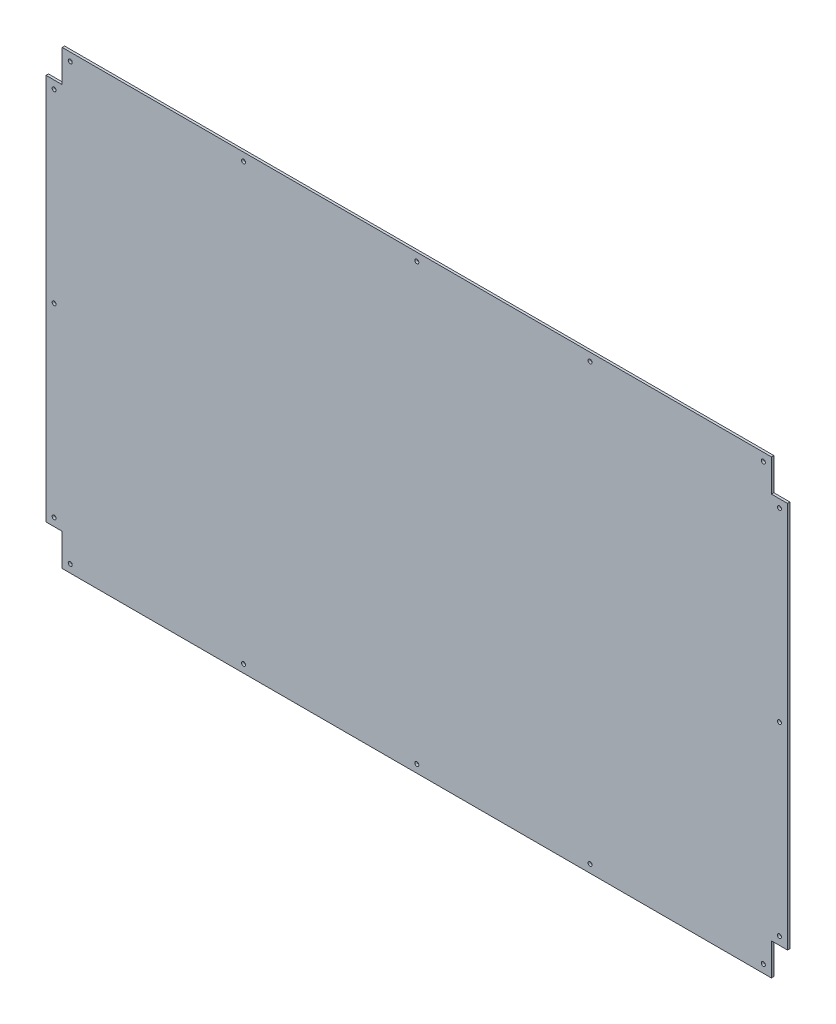
ISO-10303-21;
HEADER;
FILE_DESCRIPTION(('STEP AP214'),'2;1');
FILE_NAME('part.step','',(''),(''),'','','');
FILE_SCHEMA(('AUTOMOTIVE_DESIGN { 1 0 10303 214 1 1 1 1 }'));
ENDSEC;
DATA;
#1=APPLICATION_CONTEXT('core data for automotive mechanical design processes');
#2=APPLICATION_PROTOCOL_DEFINITION('international standard','automotive_design',2000,#1);
#3=PRODUCT_CONTEXT('',#1,'mechanical');
#4=PRODUCT('Part','Part','',(#3));
#5=PRODUCT_RELATED_PRODUCT_CATEGORY('part','',(#4));
#6=PRODUCT_DEFINITION_FORMATION('','',#4);
#7=PRODUCT_DEFINITION_CONTEXT('part definition',#1,'design');
#8=PRODUCT_DEFINITION('design','',#6,#7);
#9=PRODUCT_DEFINITION_SHAPE('','',#8);
#10=(LENGTH_UNIT() NAMED_UNIT(*) SI_UNIT(.MILLI.,.METRE.));
#11=(NAMED_UNIT(*) PLANE_ANGLE_UNIT() SI_UNIT($,.RADIAN.));
#12=(NAMED_UNIT(*) SI_UNIT($,.STERADIAN.) SOLID_ANGLE_UNIT());
#13=UNCERTAINTY_MEASURE_WITH_UNIT(LENGTH_MEASURE(1.E-05),#10,'distance_accuracy_value','');
#14=(GEOMETRIC_REPRESENTATION_CONTEXT(3) GLOBAL_UNCERTAINTY_ASSIGNED_CONTEXT((#13)) GLOBAL_UNIT_ASSIGNED_CONTEXT((#10,
#11,#12)) REPRESENTATION_CONTEXT('',''));
#15=CARTESIAN_POINT('',(0.,0.,0.));
#16=DIRECTION('',(0.,0.,1.));
#17=DIRECTION('',(1.,0.,0.));
#18=AXIS2_PLACEMENT_3D('',#15,#16,#17);
#19=CARTESIAN_POINT('',(-389.697293258029,339.185509658483,3.));
#20=DIRECTION('',(1.,0.,0.));
#21=DIRECTION('',(0.,0.,-1.));
#22=AXIS2_PLACEMENT_3D('',#19,#20,#21);
#23=PLANE('',#22);
#24=DIRECTION('',(0.,-1.,0.));
#25=VECTOR('',#24,1.);
#26=CARTESIAN_POINT('',(-389.697293258029,339.185509658483,0.));
#27=LINE('',#26,#25);
#28=CARTESIAN_POINT('',(-389.697293258029,339.185509658483,0.));
#29=VERTEX_POINT('',#28);
#30=CARTESIAN_POINT('',(-389.697293258029,299.185509658483,0.));
#31=VERTEX_POINT('',#30);
#32=EDGE_CURVE('E153',#29,#31,#27,.T.);
#33=ORIENTED_EDGE('',*,*,#32,.T.);
#34=DIRECTION('',(0.,0.,-1.));
#35=VECTOR('',#34,1.);
#36=CARTESIAN_POINT('',(-389.697293258029,299.185509658483,3.));
#37=LINE('',#36,#35);
#38=CARTESIAN_POINT('',(-389.697293258029,299.185509658483,3.));
#39=VERTEX_POINT('',#38);
#40=EDGE_CURVE('E11',#39,#31,#37,.T.);
#41=ORIENTED_EDGE('',*,*,#40,.F.);
#42=DIRECTION('',(0.,-1.,0.));
#43=VECTOR('',#42,1.);
#44=CARTESIAN_POINT('',(-389.697293258029,339.185509658483,3.));
#45=LINE('',#44,#43);
#46=CARTESIAN_POINT('',(-389.697293258029,339.185509658483,3.));
#47=VERTEX_POINT('',#46);
#48=EDGE_CURVE('E176',#47,#39,#45,.T.);
#49=ORIENTED_EDGE('',*,*,#48,.F.);
#50=DIRECTION('',(0.,0.,-1.));
#51=VECTOR('',#50,1.);
#52=CARTESIAN_POINT('',(-389.697293258029,339.185509658483,3.));
#53=LINE('',#52,#51);
#54=EDGE_CURVE('E149',#47,#29,#53,.T.);
#55=ORIENTED_EDGE('',*,*,#54,.T.);
#56=EDGE_LOOP('',(#33,#41,#49,#55));
#57=FACE_BOUND('',#56,.T.);
#58=ADVANCED_FACE('F33',(#57),#23,.F.);
#59=CARTESIAN_POINT('',(-409.697293258029,299.185509658483,3.));
#60=DIRECTION('',(0.,-1.,0.));
#61=DIRECTION('',(1.,0.,0.));
#62=AXIS2_PLACEMENT_3D('',#59,#60,#61);
#63=PLANE('',#62);
#64=DIRECTION('',(-1.,0.,0.));
#65=VECTOR('',#64,1.);
#66=CARTESIAN_POINT('',(-409.697293258029,299.185509658483,0.));
#67=LINE('',#66,#65);
#68=CARTESIAN_POINT('',(-409.697293258029,299.185509658483,0.));
#69=VERTEX_POINT('',#68);
#70=EDGE_CURVE('E156',#31,#69,#67,.T.);
#71=ORIENTED_EDGE('',*,*,#70,.T.);
#72=DIRECTION('',(0.,0.,-1.));
#73=VECTOR('',#72,1.);
#74=CARTESIAN_POINT('',(-409.697293258029,299.185509658483,3.));
#75=LINE('',#74,#73);
#76=CARTESIAN_POINT('',(-409.697293258029,299.185509658483,3.));
#77=VERTEX_POINT('',#76);
#78=EDGE_CURVE('E41',#77,#69,#75,.T.);
#79=ORIENTED_EDGE('',*,*,#78,.F.);
#80=DIRECTION('',(-1.,0.,0.));
#81=VECTOR('',#80,1.);
#82=CARTESIAN_POINT('',(-409.697293258029,299.185509658483,3.));
#83=LINE('',#82,#81);
#84=EDGE_CURVE('E104',#39,#77,#83,.T.);
#85=ORIENTED_EDGE('',*,*,#84,.F.);
#86=ORIENTED_EDGE('',*,*,#40,.T.);
#87=EDGE_LOOP('',(#71,#79,#85,#86));
#88=FACE_BOUND('',#87,.T.);
#89=ADVANCED_FACE('F256',(#88),#63,.F.);
#90=CARTESIAN_POINT('',(-409.697293258029,299.185509658483,3.));
#91=DIRECTION('',(1.,0.,0.));
#92=DIRECTION('',(0.,1.,0.));
#93=AXIS2_PLACEMENT_3D('',#90,#91,#92);
#94=PLANE('',#93);
#95=DIRECTION('',(0.,-1.,0.));
#96=VECTOR('',#95,1.);
#97=CARTESIAN_POINT('',(-409.697293258029,299.185509658483,0.));
#98=LINE('',#97,#96);
#99=CARTESIAN_POINT('',(-409.697293258029,-180.814490341518,0.));
#100=VERTEX_POINT('',#99);
#101=EDGE_CURVE('E159',#69,#100,#98,.T.);
#102=ORIENTED_EDGE('',*,*,#101,.T.);
#103=DIRECTION('',(0.,0.,-1.));
#104=VECTOR('',#103,1.);
#105=CARTESIAN_POINT('',(-409.697293258029,-180.814490341518,3.));
#106=LINE('',#105,#104);
#107=CARTESIAN_POINT('',(-409.697293258029,-180.814490341518,3.));
#108=VERTEX_POINT('',#107);
#109=EDGE_CURVE('E195',#108,#100,#106,.T.);
#110=ORIENTED_EDGE('',*,*,#109,.F.);
#111=DIRECTION('',(0.,-1.,0.));
#112=VECTOR('',#111,1.);
#113=CARTESIAN_POINT('',(-409.697293258029,299.185509658483,3.));
#114=LINE('',#113,#112);
#115=EDGE_CURVE('E203',#77,#108,#114,.T.);
#116=ORIENTED_EDGE('',*,*,#115,.F.);
#117=ORIENTED_EDGE('',*,*,#78,.T.);
#118=EDGE_LOOP('',(#102,#110,#116,#117));
#119=FACE_BOUND('',#118,.T.);
#120=ADVANCED_FACE('F201',(#119),#94,.F.);
#121=CARTESIAN_POINT('',(-409.697293258029,-180.814490341518,3.));
#122=DIRECTION('',(0.,1.,0.));
#123=DIRECTION('',(0.,0.,1.));
#124=AXIS2_PLACEMENT_3D('',#121,#122,#123);
#125=PLANE('',#124);
#126=DIRECTION('',(1.,0.,0.));
#127=VECTOR('',#126,1.);
#128=CARTESIAN_POINT('',(-409.697293258029,-180.814490341518,0.));
#129=LINE('',#128,#127);
#130=CARTESIAN_POINT('',(-389.697293258029,-180.814490341518,0.));
#131=VERTEX_POINT('',#130);
#132=EDGE_CURVE('E161',#100,#131,#129,.T.);
#133=ORIENTED_EDGE('',*,*,#132,.T.);
#134=DIRECTION('',(0.,0.,-1.));
#135=VECTOR('',#134,1.);
#136=CARTESIAN_POINT('',(-389.697293258029,-180.814490341518,3.));
#137=LINE('',#136,#135);
#138=CARTESIAN_POINT('',(-389.697293258029,-180.814490341518,3.));
#139=VERTEX_POINT('',#138);
#140=EDGE_CURVE('E192',#139,#131,#137,.T.);
#141=ORIENTED_EDGE('',*,*,#140,.F.);
#142=DIRECTION('',(1.,0.,0.));
#143=VECTOR('',#142,1.);
#144=CARTESIAN_POINT('',(-409.697293258029,-180.814490341518,3.));
#145=LINE('',#144,#143);
#146=EDGE_CURVE('E221',#108,#139,#145,.T.);
#147=ORIENTED_EDGE('',*,*,#146,.F.);
#148=ORIENTED_EDGE('',*,*,#109,.T.);
#149=EDGE_LOOP('',(#133,#141,#147,#148));
#150=FACE_BOUND('',#149,.T.);
#151=ADVANCED_FACE('F212',(#150),#125,.F.);
#152=CARTESIAN_POINT('',(-389.697293258029,-180.814490341518,3.));
#153=DIRECTION('',(1.,0.,0.));
#154=DIRECTION('',(0.,1.,0.));
#155=AXIS2_PLACEMENT_3D('',#152,#153,#154);
#156=PLANE('',#155);
#157=DIRECTION('',(0.,-1.,0.));
#158=VECTOR('',#157,1.);
#159=CARTESIAN_POINT('',(-389.697293258029,-180.814490341518,0.));
#160=LINE('',#159,#158);
#161=CARTESIAN_POINT('',(-389.697293258029,-220.814490341518,0.));
#162=VERTEX_POINT('',#161);
#163=EDGE_CURVE('E163',#131,#162,#160,.T.);
#164=ORIENTED_EDGE('',*,*,#163,.T.);
#165=DIRECTION('',(0.,0.,-1.));
#166=VECTOR('',#165,1.);
#167=CARTESIAN_POINT('',(-389.697293258029,-220.814490341518,3.));
#168=LINE('',#167,#166);
#169=CARTESIAN_POINT('',(-389.697293258029,-220.814490341518,3.));
#170=VERTEX_POINT('',#169);
#171=EDGE_CURVE('E189',#170,#162,#168,.T.);
#172=ORIENTED_EDGE('',*,*,#171,.F.);
#173=DIRECTION('',(0.,-1.,0.));
#174=VECTOR('',#173,1.);
#175=CARTESIAN_POINT('',(-389.697293258029,-180.814490341518,3.));
#176=LINE('',#175,#174);
#177=EDGE_CURVE('E218',#139,#170,#176,.T.);
#178=ORIENTED_EDGE('',*,*,#177,.F.);
#179=ORIENTED_EDGE('',*,*,#140,.T.);
#180=EDGE_LOOP('',(#164,#172,#178,#179));
#181=FACE_BOUND('',#180,.T.);
#182=ADVANCED_FACE('F216',(#181),#156,.F.);
#183=CARTESIAN_POINT('',(-389.697293258029,-220.814490341518,3.));
#184=DIRECTION('',(0.,1.,0.));
#185=DIRECTION('',(0.,0.,1.));
#186=AXIS2_PLACEMENT_3D('',#183,#184,#185);
#187=PLANE('',#186);
#188=DIRECTION('',(1.,0.,0.));
#189=VECTOR('',#188,1.);
#190=CARTESIAN_POINT('',(-389.697293258029,-220.814490341518,0.));
#191=LINE('',#190,#189);
#192=CARTESIAN_POINT('',(490.302706741972,-220.814490341518,0.));
#193=VERTEX_POINT('',#192);
#194=EDGE_CURVE('E165',#162,#193,#191,.T.);
#195=ORIENTED_EDGE('',*,*,#194,.T.);
#196=DIRECTION('',(0.,0.,-1.));
#197=VECTOR('',#196,1.);
#198=CARTESIAN_POINT('',(490.302706741972,-220.814490341518,3.));
#199=LINE('',#198,#197);
#200=CARTESIAN_POINT('',(490.302706741972,-220.814490341518,3.));
#201=VERTEX_POINT('',#200);
#202=EDGE_CURVE('E186',#201,#193,#199,.T.);
#203=ORIENTED_EDGE('',*,*,#202,.F.);
#204=DIRECTION('',(1.,0.,0.));
#205=VECTOR('',#204,1.);
#206=CARTESIAN_POINT('',(-389.697293258029,-220.814490341518,3.));
#207=LINE('',#206,#205);
#208=EDGE_CURVE('E220',#170,#201,#207,.T.);
#209=ORIENTED_EDGE('',*,*,#208,.F.);
#210=ORIENTED_EDGE('',*,*,#171,.T.);
#211=EDGE_LOOP('',(#195,#203,#209,#210));
#212=FACE_BOUND('',#211,.T.);
#213=ADVANCED_FACE('F269',(#212),#187,.F.);
#214=CARTESIAN_POINT('',(490.302706741972,-180.814490341518,3.));
#215=DIRECTION('',(-1.,0.,0.));
#216=DIRECTION('',(0.,0.,1.));
#217=AXIS2_PLACEMENT_3D('',#214,#215,#216);
#218=PLANE('',#217);
#219=DIRECTION('',(0.,1.,0.));
#220=VECTOR('',#219,1.);
#221=CARTESIAN_POINT('',(490.302706741972,-180.814490341518,0.));
#222=LINE('',#221,#220);
#223=CARTESIAN_POINT('',(490.302706741972,-180.814490341518,0.));
#224=VERTEX_POINT('',#223);
#225=EDGE_CURVE('E167',#193,#224,#222,.T.);
#226=ORIENTED_EDGE('',*,*,#225,.T.);
#227=DIRECTION('',(0.,0.,-1.));
#228=VECTOR('',#227,1.);
#229=CARTESIAN_POINT('',(490.302706741972,-180.814490341518,3.));
#230=LINE('',#229,#228);
#231=CARTESIAN_POINT('',(490.302706741972,-180.814490341518,3.));
#232=VERTEX_POINT('',#231);
#233=EDGE_CURVE('E183',#232,#224,#230,.T.);
#234=ORIENTED_EDGE('',*,*,#233,.F.);
#235=DIRECTION('',(0.,1.,0.));
#236=VECTOR('',#235,1.);
#237=CARTESIAN_POINT('',(490.302706741972,-180.814490341518,3.));
#238=LINE('',#237,#236);
#239=EDGE_CURVE('E223',#201,#232,#238,.T.);
#240=ORIENTED_EDGE('',*,*,#239,.F.);
#241=ORIENTED_EDGE('',*,*,#202,.T.);
#242=EDGE_LOOP('',(#226,#234,#240,#241));
#243=FACE_BOUND('',#242,.T.);
#244=ADVANCED_FACE('F272',(#243),#218,.F.);
#245=CARTESIAN_POINT('',(490.302706741972,-180.814490341518,3.));
#246=DIRECTION('',(0.,1.,0.));
#247=DIRECTION('',(-1.,0.,0.));
#248=AXIS2_PLACEMENT_3D('',#245,#246,#247);
#249=PLANE('',#248);
#250=DIRECTION('',(1.,0.,0.));
#251=VECTOR('',#250,1.);
#252=CARTESIAN_POINT('',(490.302706741972,-180.814490341518,0.));
#253=LINE('',#252,#251);
#254=CARTESIAN_POINT('',(510.302706741972,-180.814490341518,0.));
#255=VERTEX_POINT('',#254);
#256=EDGE_CURVE('E169',#224,#255,#253,.T.);
#257=ORIENTED_EDGE('',*,*,#256,.T.);
#258=DIRECTION('',(0.,0.,-1.));
#259=VECTOR('',#258,1.);
#260=CARTESIAN_POINT('',(510.302706741972,-180.814490341518,3.));
#261=LINE('',#260,#259);
#262=CARTESIAN_POINT('',(510.302706741972,-180.814490341518,3.));
#263=VERTEX_POINT('',#262);
#264=EDGE_CURVE('E180',#263,#255,#261,.T.);
#265=ORIENTED_EDGE('',*,*,#264,.F.);
#266=DIRECTION('',(1.,0.,0.));
#267=VECTOR('',#266,1.);
#268=CARTESIAN_POINT('',(490.302706741972,-180.814490341518,3.));
#269=LINE('',#268,#267);
#270=EDGE_CURVE('E229',#232,#263,#269,.T.);
#271=ORIENTED_EDGE('',*,*,#270,.F.);
#272=ORIENTED_EDGE('',*,*,#233,.T.);
#273=EDGE_LOOP('',(#257,#265,#271,#272));
#274=FACE_BOUND('',#273,.T.);
#275=ADVANCED_FACE('F235',(#274),#249,.F.);
#276=CARTESIAN_POINT('',(510.302706741971,299.185509658483,3.));
#277=DIRECTION('',(-1.,0.,0.));
#278=DIRECTION('',(0.,-1.,0.));
#279=AXIS2_PLACEMENT_3D('',#276,#277,#278);
#280=PLANE('',#279);
#281=DIRECTION('',(0.,1.,0.));
#282=VECTOR('',#281,1.);
#283=CARTESIAN_POINT('',(510.302706741971,299.185509658483,0.));
#284=LINE('',#283,#282);
#285=CARTESIAN_POINT('',(510.302706741971,299.185509658483,0.));
#286=VERTEX_POINT('',#285);
#287=EDGE_CURVE('E171',#255,#286,#284,.T.);
#288=ORIENTED_EDGE('',*,*,#287,.T.);
#289=DIRECTION('',(0.,0.,-1.));
#290=VECTOR('',#289,1.);
#291=CARTESIAN_POINT('',(510.302706741971,299.185509658483,3.));
#292=LINE('',#291,#290);
#293=CARTESIAN_POINT('',(510.302706741971,299.185509658483,3.));
#294=VERTEX_POINT('',#293);
#295=EDGE_CURVE('E144',#294,#286,#292,.T.);
#296=ORIENTED_EDGE('',*,*,#295,.F.);
#297=DIRECTION('',(0.,1.,0.));
#298=VECTOR('',#297,1.);
#299=CARTESIAN_POINT('',(510.302706741971,299.185509658483,3.));
#300=LINE('',#299,#298);
#301=EDGE_CURVE('E135',#263,#294,#300,.T.);
#302=ORIENTED_EDGE('',*,*,#301,.F.);
#303=ORIENTED_EDGE('',*,*,#264,.T.);
#304=EDGE_LOOP('',(#288,#296,#302,#303));
#305=FACE_BOUND('',#304,.T.);
#306=ADVANCED_FACE('F239',(#305),#280,.F.);
#307=CARTESIAN_POINT('',(490.302706741971,299.185509658483,3.));
#308=DIRECTION('',(0.,-1.,0.));
#309=DIRECTION('',(0.,0.,-1.));
#310=AXIS2_PLACEMENT_3D('',#307,#308,#309);
#311=PLANE('',#310);
#312=DIRECTION('',(-1.,0.,0.));
#313=VECTOR('',#312,1.);
#314=CARTESIAN_POINT('',(490.302706741971,299.185509658483,0.));
#315=LINE('',#314,#313);
#316=CARTESIAN_POINT('',(490.302706741971,299.185509658483,0.));
#317=VERTEX_POINT('',#316);
#318=EDGE_CURVE('E143',#286,#317,#315,.T.);
#319=ORIENTED_EDGE('',*,*,#318,.T.);
#320=DIRECTION('',(0.,0.,-1.));
#321=VECTOR('',#320,1.);
#322=CARTESIAN_POINT('',(490.302706741971,299.185509658483,3.));
#323=LINE('',#322,#321);
#324=CARTESIAN_POINT('',(490.302706741971,299.185509658483,3.));
#325=VERTEX_POINT('',#324);
#326=EDGE_CURVE('E140',#325,#317,#323,.T.);
#327=ORIENTED_EDGE('',*,*,#326,.F.);
#328=DIRECTION('',(-1.,0.,0.));
#329=VECTOR('',#328,1.);
#330=CARTESIAN_POINT('',(490.302706741971,299.185509658483,3.));
#331=LINE('',#330,#329);
#332=EDGE_CURVE('E129',#294,#325,#331,.T.);
#333=ORIENTED_EDGE('',*,*,#332,.F.);
#334=ORIENTED_EDGE('',*,*,#295,.T.);
#335=EDGE_LOOP('',(#319,#327,#333,#334));
#336=FACE_BOUND('',#335,.T.);
#337=ADVANCED_FACE('F141',(#336),#311,.F.);
#338=CARTESIAN_POINT('',(490.302706741971,339.185509658483,3.));
#339=DIRECTION('',(-1.,0.,0.));
#340=DIRECTION('',(0.,0.,1.));
#341=AXIS2_PLACEMENT_3D('',#338,#339,#340);
#342=PLANE('',#341);
#343=DIRECTION('',(0.,1.,0.));
#344=VECTOR('',#343,1.);
#345=CARTESIAN_POINT('',(490.302706741971,339.185509658483,0.));
#346=LINE('',#345,#344);
#347=CARTESIAN_POINT('',(490.302706741971,339.185509658483,0.));
#348=VERTEX_POINT('',#347);
#349=EDGE_CURVE('E90',#317,#348,#346,.T.);
#350=ORIENTED_EDGE('',*,*,#349,.T.);
#351=DIRECTION('',(0.,0.,-1.));
#352=VECTOR('',#351,1.);
#353=CARTESIAN_POINT('',(490.302706741971,339.185509658483,3.));
#354=LINE('',#353,#352);
#355=CARTESIAN_POINT('',(490.302706741971,339.185509658483,3.));
#356=VERTEX_POINT('',#355);
#357=EDGE_CURVE('E145',#356,#348,#354,.T.);
#358=ORIENTED_EDGE('',*,*,#357,.F.);
#359=DIRECTION('',(0.,1.,0.));
#360=VECTOR('',#359,1.);
#361=CARTESIAN_POINT('',(490.302706741971,339.185509658483,3.));
#362=LINE('',#361,#360);
#363=EDGE_CURVE('E133',#325,#356,#362,.T.);
#364=ORIENTED_EDGE('',*,*,#363,.F.);
#365=ORIENTED_EDGE('',*,*,#326,.T.);
#366=EDGE_LOOP('',(#350,#358,#364,#365));
#367=FACE_BOUND('',#366,.T.);
#368=ADVANCED_FACE('F147',(#367),#342,.F.);
#369=CARTESIAN_POINT('',(-389.697293258029,339.185509658483,3.));
#370=DIRECTION('',(0.,-1.,0.));
#371=DIRECTION('',(1.,0.,0.));
#372=AXIS2_PLACEMENT_3D('',#369,#370,#371);
#373=PLANE('',#372);
#374=DIRECTION('',(-1.,0.,0.));
#375=VECTOR('',#374,1.);
#376=CARTESIAN_POINT('',(-389.697293258029,339.185509658483,0.));
#377=LINE('',#376,#375);
#378=EDGE_CURVE('E96',#348,#29,#377,.T.);
#379=ORIENTED_EDGE('',*,*,#378,.T.);
#380=ORIENTED_EDGE('',*,*,#54,.F.);
#381=DIRECTION('',(-1.,0.,0.));
#382=VECTOR('',#381,1.);
#383=CARTESIAN_POINT('',(-389.697293258029,339.185509658483,3.));
#384=LINE('',#383,#382);
#385=EDGE_CURVE('E49',#356,#47,#384,.T.);
#386=ORIENTED_EDGE('',*,*,#385,.F.);
#387=ORIENTED_EDGE('',*,*,#357,.T.);
#388=EDGE_LOOP('',(#379,#380,#386,#387));
#389=FACE_BOUND('',#388,.T.);
#390=ADVANCED_FACE('F243',(#389),#373,.F.);
#391=CARTESIAN_POINT('',(0.,0.,3.));
#392=DIRECTION('',(0.,0.,1.));
#393=DIRECTION('',(1.,0.,0.));
#394=AXIS2_PLACEMENT_3D('',#391,#392,#393);
#395=PLANE('',#394);
#396=CARTESIAN_POINT('',(265.302706741971,329.185509658483,3.));
#397=DIRECTION('',(0.,0.,1.));
#398=DIRECTION('',(1.,0.,0.));
#399=AXIS2_PLACEMENT_3D('',#396,#397,#398);
#400=CIRCLE('',#399,2.50000000000002);
#401=CARTESIAN_POINT('',(267.802706741971,329.185509658483,3.));
#402=VERTEX_POINT('',#401);
#403=EDGE_CURVE('E473',#402,#402,#400,.T.);
#404=ORIENTED_EDGE('',*,*,#403,.F.);
#405=EDGE_LOOP('',(#404));
#406=FACE_BOUND('',#405,.T.);
#407=CARTESIAN_POINT('',(50.3027067419713,329.185509658483,3.));
#408=DIRECTION('',(0.,0.,1.));
#409=DIRECTION('',(1.,0.,0.));
#410=AXIS2_PLACEMENT_3D('',#407,#408,#409);
#411=CIRCLE('',#410,2.50000000000002);
#412=CARTESIAN_POINT('',(52.8027067419713,329.185509658483,3.));
#413=VERTEX_POINT('',#412);
#414=EDGE_CURVE('E476',#413,#413,#411,.T.);
#415=ORIENTED_EDGE('',*,*,#414,.F.);
#416=EDGE_LOOP('',(#415));
#417=FACE_BOUND('',#416,.T.);
#418=CARTESIAN_POINT('',(-164.697293258029,329.185509658483,3.));
#419=DIRECTION('',(0.,0.,1.));
#420=DIRECTION('',(1.,0.,0.));
#421=AXIS2_PLACEMENT_3D('',#418,#419,#420);
#422=CIRCLE('',#421,2.50000000000002);
#423=CARTESIAN_POINT('',(-162.197293258029,329.185509658483,3.));
#424=VERTEX_POINT('',#423);
#425=EDGE_CURVE('E493',#424,#424,#422,.T.);
#426=ORIENTED_EDGE('',*,*,#425,.F.);
#427=EDGE_LOOP('',(#426));
#428=FACE_BOUND('',#427,.T.);
#429=CARTESIAN_POINT('',(480.302706741971,329.185509658483,3.));
#430=DIRECTION('',(0.,0.,1.));
#431=DIRECTION('',(1.,0.,0.));
#432=AXIS2_PLACEMENT_3D('',#429,#430,#431);
#433=CIRCLE('',#432,2.50000000000002);
#434=CARTESIAN_POINT('',(482.802706741971,329.185509658483,3.));
#435=VERTEX_POINT('',#434);
#436=EDGE_CURVE('E487',#435,#435,#433,.T.);
#437=ORIENTED_EDGE('',*,*,#436,.F.);
#438=EDGE_LOOP('',(#437));
#439=FACE_BOUND('',#438,.T.);
#440=CARTESIAN_POINT('',(50.3027067419715,-210.814490341518,3.));
#441=DIRECTION('',(0.,0.,1.));
#442=DIRECTION('',(1.,0.,0.));
#443=AXIS2_PLACEMENT_3D('',#440,#441,#442);
#444=CIRCLE('',#443,2.50000000000001);
#445=CARTESIAN_POINT('',(52.8027067419716,-210.814490341518,3.));
#446=VERTEX_POINT('',#445);
#447=EDGE_CURVE('E507',#446,#446,#444,.T.);
#448=ORIENTED_EDGE('',*,*,#447,.F.);
#449=EDGE_LOOP('',(#448));
#450=FACE_BOUND('',#449,.T.);
#451=CARTESIAN_POINT('',(265.302706741972,-210.814490341518,3.));
#452=DIRECTION('',(0.,0.,1.));
#453=DIRECTION('',(1.,0.,0.));
#454=AXIS2_PLACEMENT_3D('',#451,#452,#453);
#455=CIRCLE('',#454,2.50000000000002);
#456=CARTESIAN_POINT('',(267.802706741972,-210.814490341518,3.));
#457=VERTEX_POINT('',#456);
#458=EDGE_CURVE('E501',#457,#457,#455,.T.);
#459=ORIENTED_EDGE('',*,*,#458,.F.);
#460=EDGE_LOOP('',(#459));
#461=FACE_BOUND('',#460,.T.);
#462=CARTESIAN_POINT('',(480.302706741972,-210.814490341518,3.));
#463=DIRECTION('',(0.,0.,1.));
#464=DIRECTION('',(1.,0.,0.));
#465=AXIS2_PLACEMENT_3D('',#462,#463,#464);
#466=CIRCLE('',#465,2.50000000000002);
#467=CARTESIAN_POINT('',(482.802706741972,-210.814490341518,3.));
#468=VERTEX_POINT('',#467);
#469=EDGE_CURVE('E500',#468,#468,#466,.T.);
#470=ORIENTED_EDGE('',*,*,#469,.F.);
#471=EDGE_LOOP('',(#470));
#472=FACE_BOUND('',#471,.T.);
#473=CARTESIAN_POINT('',(-379.697293258029,-210.814490341518,3.));
#474=DIRECTION('',(0.,0.,1.));
#475=DIRECTION('',(1.,0.,0.));
#476=AXIS2_PLACEMENT_3D('',#473,#474,#475);
#477=CIRCLE('',#476,2.50000000000002);
#478=CARTESIAN_POINT('',(-377.197293258029,-210.814490341518,3.));
#479=VERTEX_POINT('',#478);
#480=EDGE_CURVE('E479',#479,#479,#477,.T.);
#481=ORIENTED_EDGE('',*,*,#480,.F.);
#482=EDGE_LOOP('',(#481));
#483=FACE_BOUND('',#482,.T.);
#484=CARTESIAN_POINT('',(-399.697293258029,59.1855096584826,3.));
#485=DIRECTION('',(0.,0.,1.));
#486=DIRECTION('',(1.,0.,0.));
#487=AXIS2_PLACEMENT_3D('',#484,#485,#486);
#488=CIRCLE('',#487,2.50000000000002);
#489=CARTESIAN_POINT('',(-397.197293258029,59.1855096584826,3.));
#490=VERTEX_POINT('',#489);
#491=EDGE_CURVE('E537',#490,#490,#488,.T.);
#492=ORIENTED_EDGE('',*,*,#491,.F.);
#493=EDGE_LOOP('',(#492));
#494=FACE_BOUND('',#493,.T.);
#495=CARTESIAN_POINT('',(-399.697293258029,-170.814490341518,3.));
#496=DIRECTION('',(0.,0.,1.));
#497=DIRECTION('',(1.,0.,0.));
#498=AXIS2_PLACEMENT_3D('',#495,#496,#497);
#499=CIRCLE('',#498,2.50000000000002);
#500=CARTESIAN_POINT('',(-397.197293258029,-170.814490341518,3.));
#501=VERTEX_POINT('',#500);
#502=EDGE_CURVE('E541',#501,#501,#499,.T.);
#503=ORIENTED_EDGE('',*,*,#502,.F.);
#504=EDGE_LOOP('',(#503));
#505=FACE_BOUND('',#504,.T.);
#506=CARTESIAN_POINT('',(-399.697293258029,289.185509658483,3.));
#507=DIRECTION('',(0.,0.,1.));
#508=DIRECTION('',(1.,0.,0.));
#509=AXIS2_PLACEMENT_3D('',#506,#507,#508);
#510=CIRCLE('',#509,2.50000000000002);
#511=CARTESIAN_POINT('',(-397.197293258029,289.185509658483,3.));
#512=VERTEX_POINT('',#511);
#513=EDGE_CURVE('E545',#512,#512,#510,.T.);
#514=ORIENTED_EDGE('',*,*,#513,.F.);
#515=EDGE_LOOP('',(#514));
#516=FACE_BOUND('',#515,.T.);
#517=CARTESIAN_POINT('',(-164.697293258029,-210.814490341518,3.));
#518=DIRECTION('',(0.,0.,1.));
#519=DIRECTION('',(1.,0.,0.));
#520=AXIS2_PLACEMENT_3D('',#517,#518,#519);
#521=CIRCLE('',#520,2.50000000000002);
#522=CARTESIAN_POINT('',(-162.197293258029,-210.814490341518,3.));
#523=VERTEX_POINT('',#522);
#524=EDGE_CURVE('E549',#523,#523,#521,.T.);
#525=ORIENTED_EDGE('',*,*,#524,.F.);
#526=EDGE_LOOP('',(#525));
#527=FACE_BOUND('',#526,.T.);
#528=CARTESIAN_POINT('',(500.302706741972,289.185509658483,3.));
#529=DIRECTION('',(0.,0.,1.));
#530=DIRECTION('',(1.,0.,0.));
#531=AXIS2_PLACEMENT_3D('',#528,#529,#530);
#532=CIRCLE('',#531,2.50000000000002);
#533=CARTESIAN_POINT('',(502.802706741972,289.185509658483,3.));
#534=VERTEX_POINT('',#533);
#535=EDGE_CURVE('E553',#534,#534,#532,.T.);
#536=ORIENTED_EDGE('',*,*,#535,.F.);
#537=EDGE_LOOP('',(#536));
#538=FACE_BOUND('',#537,.T.);
#539=CARTESIAN_POINT('',(500.302706741972,59.1855096584825,3.));
#540=DIRECTION('',(0.,0.,1.));
#541=DIRECTION('',(1.,0.,0.));
#542=AXIS2_PLACEMENT_3D('',#539,#540,#541);
#543=CIRCLE('',#542,2.50000000000003);
#544=CARTESIAN_POINT('',(502.802706741972,59.1855096584825,3.));
#545=VERTEX_POINT('',#544);
#546=EDGE_CURVE('E557',#545,#545,#543,.T.);
#547=ORIENTED_EDGE('',*,*,#546,.F.);
#548=EDGE_LOOP('',(#547));
#549=FACE_BOUND('',#548,.T.);
#550=CARTESIAN_POINT('',(500.302706741972,-170.814490341517,3.));
#551=DIRECTION('',(0.,0.,1.));
#552=DIRECTION('',(1.,0.,0.));
#553=AXIS2_PLACEMENT_3D('',#550,#551,#552);
#554=CIRCLE('',#553,2.50000000000003);
#555=CARTESIAN_POINT('',(502.802706741972,-170.814490341517,3.));
#556=VERTEX_POINT('',#555);
#557=EDGE_CURVE('E560',#556,#556,#554,.T.);
#558=ORIENTED_EDGE('',*,*,#557,.F.);
#559=EDGE_LOOP('',(#558));
#560=FACE_BOUND('',#559,.T.);
#561=CARTESIAN_POINT('',(-379.697293258029,329.185509658483,3.));
#562=DIRECTION('',(0.,0.,1.));
#563=DIRECTION('',(1.,0.,0.));
#564=AXIS2_PLACEMENT_3D('',#561,#562,#563);
#565=CIRCLE('',#564,2.50000000000002);
#566=CARTESIAN_POINT('',(-377.197293258029,329.185509658483,3.));
#567=VERTEX_POINT('',#566);
#568=EDGE_CURVE('E486',#567,#567,#565,.T.);
#569=ORIENTED_EDGE('',*,*,#568,.F.);
#570=EDGE_LOOP('',(#569));
#571=FACE_BOUND('',#570,.T.);
#572=ORIENTED_EDGE('',*,*,#48,.T.);
#573=ORIENTED_EDGE('',*,*,#84,.T.);
#574=ORIENTED_EDGE('',*,*,#115,.T.);
#575=ORIENTED_EDGE('',*,*,#146,.T.);
#576=ORIENTED_EDGE('',*,*,#177,.T.);
#577=ORIENTED_EDGE('',*,*,#208,.T.);
#578=ORIENTED_EDGE('',*,*,#239,.T.);
#579=ORIENTED_EDGE('',*,*,#270,.T.);
#580=ORIENTED_EDGE('',*,*,#301,.T.);
#581=ORIENTED_EDGE('',*,*,#332,.T.);
#582=ORIENTED_EDGE('',*,*,#363,.T.);
#583=ORIENTED_EDGE('',*,*,#385,.T.);
#584=EDGE_LOOP('',(#572,#573,#574,#575,#576,#577,#578,#579,#580,#581,#582,#583));
#585=FACE_BOUND('',#584,.T.);
#586=ADVANCED_FACE('F131',(#406,#417,#428,#439,#450,#461,#472,#483,#494,#505,#516,#527,#538,
#549,#560,#571,#585),#395,.T.);
#587=CARTESIAN_POINT('',(0.,0.,0.));
#588=DIRECTION('',(0.,0.,1.));
#589=DIRECTION('',(1.,0.,0.));
#590=AXIS2_PLACEMENT_3D('',#587,#588,#589);
#591=PLANE('',#590);
#592=CARTESIAN_POINT('',(265.302706741971,329.185509658483,0.));
#593=DIRECTION('',(0.,0.,1.));
#594=DIRECTION('',(1.,0.,0.));
#595=AXIS2_PLACEMENT_3D('',#592,#593,#594);
#596=CIRCLE('',#595,2.50000000000002);
#597=CARTESIAN_POINT('',(267.802706741971,329.185509658483,0.));
#598=VERTEX_POINT('',#597);
#599=EDGE_CURVE('E470',#598,#598,#596,.T.);
#600=ORIENTED_EDGE('',*,*,#599,.T.);
#601=EDGE_LOOP('',(#600));
#602=FACE_BOUND('',#601,.T.);
#603=CARTESIAN_POINT('',(50.3027067419713,329.185509658483,0.));
#604=DIRECTION('',(0.,0.,1.));
#605=DIRECTION('',(1.,0.,0.));
#606=AXIS2_PLACEMENT_3D('',#603,#604,#605);
#607=CIRCLE('',#606,2.50000000000002);
#608=CARTESIAN_POINT('',(52.8027067419713,329.185509658483,0.));
#609=VERTEX_POINT('',#608);
#610=EDGE_CURVE('E496',#609,#609,#607,.T.);
#611=ORIENTED_EDGE('',*,*,#610,.T.);
#612=EDGE_LOOP('',(#611));
#613=FACE_BOUND('',#612,.T.);
#614=CARTESIAN_POINT('',(-164.697293258029,329.185509658483,0.));
#615=DIRECTION('',(0.,0.,1.));
#616=DIRECTION('',(1.,0.,0.));
#617=AXIS2_PLACEMENT_3D('',#614,#615,#616);
#618=CIRCLE('',#617,2.50000000000002);
#619=CARTESIAN_POINT('',(-162.197293258029,329.185509658483,0.));
#620=VERTEX_POINT('',#619);
#621=EDGE_CURVE('E490',#620,#620,#618,.T.);
#622=ORIENTED_EDGE('',*,*,#621,.T.);
#623=EDGE_LOOP('',(#622));
#624=FACE_BOUND('',#623,.T.);
#625=CARTESIAN_POINT('',(480.302706741971,329.185509658483,0.));
#626=DIRECTION('',(0.,0.,1.));
#627=DIRECTION('',(1.,0.,0.));
#628=AXIS2_PLACEMENT_3D('',#625,#626,#627);
#629=CIRCLE('',#628,2.50000000000002);
#630=CARTESIAN_POINT('',(482.802706741971,329.185509658483,0.));
#631=VERTEX_POINT('',#630);
#632=EDGE_CURVE('E483',#631,#631,#629,.T.);
#633=ORIENTED_EDGE('',*,*,#632,.T.);
#634=EDGE_LOOP('',(#633));
#635=FACE_BOUND('',#634,.T.);
#636=CARTESIAN_POINT('',(50.3027067419715,-210.814490341518,0.));
#637=DIRECTION('',(0.,0.,1.));
#638=DIRECTION('',(1.,0.,0.));
#639=AXIS2_PLACEMENT_3D('',#636,#637,#638);
#640=CIRCLE('',#639,2.50000000000001);
#641=CARTESIAN_POINT('',(52.8027067419716,-210.814490341518,0.));
#642=VERTEX_POINT('',#641);
#643=EDGE_CURVE('E504',#642,#642,#640,.T.);
#644=ORIENTED_EDGE('',*,*,#643,.T.);
#645=EDGE_LOOP('',(#644));
#646=FACE_BOUND('',#645,.T.);
#647=CARTESIAN_POINT('',(265.302706741972,-210.814490341518,0.));
#648=DIRECTION('',(0.,0.,1.));
#649=DIRECTION('',(1.,0.,0.));
#650=AXIS2_PLACEMENT_3D('',#647,#648,#649);
#651=CIRCLE('',#650,2.50000000000002);
#652=CARTESIAN_POINT('',(267.802706741972,-210.814490341518,0.));
#653=VERTEX_POINT('',#652);
#654=EDGE_CURVE('E497',#653,#653,#651,.T.);
#655=ORIENTED_EDGE('',*,*,#654,.T.);
#656=EDGE_LOOP('',(#655));
#657=FACE_BOUND('',#656,.T.);
#658=CARTESIAN_POINT('',(480.302706741972,-210.814490341518,0.));
#659=DIRECTION('',(0.,0.,1.));
#660=DIRECTION('',(1.,0.,0.));
#661=AXIS2_PLACEMENT_3D('',#658,#659,#660);
#662=CIRCLE('',#661,2.50000000000002);
#663=CARTESIAN_POINT('',(482.802706741972,-210.814490341518,0.));
#664=VERTEX_POINT('',#663);
#665=EDGE_CURVE('E513',#664,#664,#662,.T.);
#666=ORIENTED_EDGE('',*,*,#665,.T.);
#667=EDGE_LOOP('',(#666));
#668=FACE_BOUND('',#667,.T.);
#669=CARTESIAN_POINT('',(-379.697293258029,-210.814490341518,0.));
#670=DIRECTION('',(0.,0.,1.));
#671=DIRECTION('',(1.,0.,0.));
#672=AXIS2_PLACEMENT_3D('',#669,#670,#671);
#673=CIRCLE('',#672,2.50000000000002);
#674=CARTESIAN_POINT('',(-377.197293258029,-210.814490341518,0.));
#675=VERTEX_POINT('',#674);
#676=EDGE_CURVE('E474',#675,#675,#673,.T.);
#677=ORIENTED_EDGE('',*,*,#676,.T.);
#678=EDGE_LOOP('',(#677));
#679=FACE_BOUND('',#678,.T.);
#680=CARTESIAN_POINT('',(-399.697293258029,59.1855096584826,0.));
#681=DIRECTION('',(0.,0.,1.));
#682=DIRECTION('',(1.,0.,0.));
#683=AXIS2_PLACEMENT_3D('',#680,#681,#682);
#684=CIRCLE('',#683,2.50000000000002);
#685=CARTESIAN_POINT('',(-397.197293258029,59.1855096584826,0.));
#686=VERTEX_POINT('',#685);
#687=EDGE_CURVE('E603',#686,#686,#684,.T.);
#688=ORIENTED_EDGE('',*,*,#687,.T.);
#689=EDGE_LOOP('',(#688));
#690=FACE_BOUND('',#689,.T.);
#691=CARTESIAN_POINT('',(-399.697293258029,-170.814490341518,0.));
#692=DIRECTION('',(0.,0.,1.));
#693=DIRECTION('',(1.,0.,0.));
#694=AXIS2_PLACEMENT_3D('',#691,#692,#693);
#695=CIRCLE('',#694,2.50000000000002);
#696=CARTESIAN_POINT('',(-397.197293258029,-170.814490341518,0.));
#697=VERTEX_POINT('',#696);
#698=EDGE_CURVE('E607',#697,#697,#695,.T.);
#699=ORIENTED_EDGE('',*,*,#698,.T.);
#700=EDGE_LOOP('',(#699));
#701=FACE_BOUND('',#700,.T.);
#702=CARTESIAN_POINT('',(-399.697293258029,289.185509658483,0.));
#703=DIRECTION('',(0.,0.,1.));
#704=DIRECTION('',(1.,0.,0.));
#705=AXIS2_PLACEMENT_3D('',#702,#703,#704);
#706=CIRCLE('',#705,2.50000000000002);
#707=CARTESIAN_POINT('',(-397.197293258029,289.185509658483,0.));
#708=VERTEX_POINT('',#707);
#709=EDGE_CURVE('E611',#708,#708,#706,.T.);
#710=ORIENTED_EDGE('',*,*,#709,.T.);
#711=EDGE_LOOP('',(#710));
#712=FACE_BOUND('',#711,.T.);
#713=CARTESIAN_POINT('',(-164.697293258029,-210.814490341518,0.));
#714=DIRECTION('',(0.,0.,1.));
#715=DIRECTION('',(1.,0.,0.));
#716=AXIS2_PLACEMENT_3D('',#713,#714,#715);
#717=CIRCLE('',#716,2.50000000000002);
#718=CARTESIAN_POINT('',(-162.197293258029,-210.814490341518,0.));
#719=VERTEX_POINT('',#718);
#720=EDGE_CURVE('E509',#719,#719,#717,.T.);
#721=ORIENTED_EDGE('',*,*,#720,.T.);
#722=EDGE_LOOP('',(#721));
#723=FACE_BOUND('',#722,.T.);
#724=CARTESIAN_POINT('',(500.302706741972,289.185509658483,0.));
#725=DIRECTION('',(0.,0.,1.));
#726=DIRECTION('',(1.,0.,0.));
#727=AXIS2_PLACEMENT_3D('',#724,#725,#726);
#728=CIRCLE('',#727,2.50000000000002);
#729=CARTESIAN_POINT('',(502.802706741972,289.185509658483,0.));
#730=VERTEX_POINT('',#729);
#731=EDGE_CURVE('E618',#730,#730,#728,.T.);
#732=ORIENTED_EDGE('',*,*,#731,.T.);
#733=EDGE_LOOP('',(#732));
#734=FACE_BOUND('',#733,.T.);
#735=CARTESIAN_POINT('',(500.302706741972,59.1855096584825,0.));
#736=DIRECTION('',(0.,0.,1.));
#737=DIRECTION('',(1.,0.,0.));
#738=AXIS2_PLACEMENT_3D('',#735,#736,#737);
#739=CIRCLE('',#738,2.50000000000003);
#740=CARTESIAN_POINT('',(502.802706741972,59.1855096584825,0.));
#741=VERTEX_POINT('',#740);
#742=EDGE_CURVE('E622',#741,#741,#739,.T.);
#743=ORIENTED_EDGE('',*,*,#742,.T.);
#744=EDGE_LOOP('',(#743));
#745=FACE_BOUND('',#744,.T.);
#746=CARTESIAN_POINT('',(500.302706741972,-170.814490341517,0.));
#747=DIRECTION('',(0.,0.,1.));
#748=DIRECTION('',(1.,0.,0.));
#749=AXIS2_PLACEMENT_3D('',#746,#747,#748);
#750=CIRCLE('',#749,2.50000000000003);
#751=CARTESIAN_POINT('',(502.802706741972,-170.814490341517,0.));
#752=VERTEX_POINT('',#751);
#753=EDGE_CURVE('E562',#752,#752,#750,.T.);
#754=ORIENTED_EDGE('',*,*,#753,.T.);
#755=EDGE_LOOP('',(#754));
#756=FACE_BOUND('',#755,.T.);
#757=CARTESIAN_POINT('',(-379.697293258029,329.185509658483,0.));
#758=DIRECTION('',(0.,0.,1.));
#759=DIRECTION('',(1.,0.,0.));
#760=AXIS2_PLACEMENT_3D('',#757,#758,#759);
#761=CIRCLE('',#760,2.50000000000002);
#762=CARTESIAN_POINT('',(-377.197293258029,329.185509658483,0.));
#763=VERTEX_POINT('',#762);
#764=EDGE_CURVE('E157',#763,#763,#761,.T.);
#765=ORIENTED_EDGE('',*,*,#764,.T.);
#766=EDGE_LOOP('',(#765));
#767=FACE_BOUND('',#766,.T.);
#768=ORIENTED_EDGE('',*,*,#32,.F.);
#769=ORIENTED_EDGE('',*,*,#378,.F.);
#770=ORIENTED_EDGE('',*,*,#349,.F.);
#771=ORIENTED_EDGE('',*,*,#318,.F.);
#772=ORIENTED_EDGE('',*,*,#287,.F.);
#773=ORIENTED_EDGE('',*,*,#256,.F.);
#774=ORIENTED_EDGE('',*,*,#225,.F.);
#775=ORIENTED_EDGE('',*,*,#194,.F.);
#776=ORIENTED_EDGE('',*,*,#163,.F.);
#777=ORIENTED_EDGE('',*,*,#132,.F.);
#778=ORIENTED_EDGE('',*,*,#101,.F.);
#779=ORIENTED_EDGE('',*,*,#70,.F.);
#780=EDGE_LOOP('',(#768,#769,#770,#771,#772,#773,#774,#775,#776,#777,#778,#779));
#781=FACE_BOUND('',#780,.T.);
#782=ADVANCED_FACE('F207',(#602,#613,#624,#635,#646,#657,#668,#679,#690,#701,#712,#723,#734,
#745,#756,#767,#781),#591,.F.);
#783=CARTESIAN_POINT('',(-379.697293258029,329.185509658483,0.));
#784=DIRECTION('',(0.,0.,1.));
#785=DIRECTION('',(1.,0.,0.));
#786=AXIS2_PLACEMENT_3D('',#783,#784,#785);
#787=CYLINDRICAL_SURFACE('',#786,2.50000000000002);
#788=ORIENTED_EDGE('',*,*,#764,.F.);
#789=EDGE_LOOP('',(#788));
#790=FACE_BOUND('',#789,.T.);
#791=ORIENTED_EDGE('',*,*,#568,.T.);
#792=EDGE_LOOP('',(#791));
#793=FACE_BOUND('',#792,.T.);
#794=ADVANCED_FACE('F305',(#790,#793),#787,.F.);
#795=CARTESIAN_POINT('',(500.302706741972,-170.814490341517,0.));
#796=DIRECTION('',(0.,0.,1.));
#797=DIRECTION('',(1.,0.,0.));
#798=AXIS2_PLACEMENT_3D('',#795,#796,#797);
#799=CYLINDRICAL_SURFACE('',#798,2.50000000000003);
#800=ORIENTED_EDGE('',*,*,#753,.F.);
#801=EDGE_LOOP('',(#800));
#802=FACE_BOUND('',#801,.T.);
#803=ORIENTED_EDGE('',*,*,#557,.T.);
#804=EDGE_LOOP('',(#803));
#805=FACE_BOUND('',#804,.T.);
#806=ADVANCED_FACE('F313',(#802,#805),#799,.F.);
#807=CARTESIAN_POINT('',(500.302706741972,59.1855096584825,0.));
#808=DIRECTION('',(0.,0.,1.));
#809=DIRECTION('',(1.,0.,0.));
#810=AXIS2_PLACEMENT_3D('',#807,#808,#809);
#811=CYLINDRICAL_SURFACE('',#810,2.50000000000003);
#812=ORIENTED_EDGE('',*,*,#742,.F.);
#813=EDGE_LOOP('',(#812));
#814=FACE_BOUND('',#813,.T.);
#815=ORIENTED_EDGE('',*,*,#546,.T.);
#816=EDGE_LOOP('',(#815));
#817=FACE_BOUND('',#816,.T.);
#818=ADVANCED_FACE('F323',(#814,#817),#811,.F.);
#819=CARTESIAN_POINT('',(500.302706741972,289.185509658483,0.));
#820=DIRECTION('',(0.,0.,1.));
#821=DIRECTION('',(1.,0.,0.));
#822=AXIS2_PLACEMENT_3D('',#819,#820,#821);
#823=CYLINDRICAL_SURFACE('',#822,2.50000000000002);
#824=ORIENTED_EDGE('',*,*,#731,.F.);
#825=EDGE_LOOP('',(#824));
#826=FACE_BOUND('',#825,.T.);
#827=ORIENTED_EDGE('',*,*,#535,.T.);
#828=EDGE_LOOP('',(#827));
#829=FACE_BOUND('',#828,.T.);
#830=ADVANCED_FACE('F333',(#826,#829),#823,.F.);
#831=CARTESIAN_POINT('',(-164.697293258029,-210.814490341518,0.));
#832=DIRECTION('',(0.,0.,1.));
#833=DIRECTION('',(1.,0.,0.));
#834=AXIS2_PLACEMENT_3D('',#831,#832,#833);
#835=CYLINDRICAL_SURFACE('',#834,2.50000000000002);
#836=ORIENTED_EDGE('',*,*,#720,.F.);
#837=EDGE_LOOP('',(#836));
#838=FACE_BOUND('',#837,.T.);
#839=ORIENTED_EDGE('',*,*,#524,.T.);
#840=EDGE_LOOP('',(#839));
#841=FACE_BOUND('',#840,.T.);
#842=ADVANCED_FACE('F343',(#838,#841),#835,.F.);
#843=CARTESIAN_POINT('',(-399.697293258029,289.185509658483,0.));
#844=DIRECTION('',(0.,0.,1.));
#845=DIRECTION('',(1.,0.,0.));
#846=AXIS2_PLACEMENT_3D('',#843,#844,#845);
#847=CYLINDRICAL_SURFACE('',#846,2.50000000000002);
#848=ORIENTED_EDGE('',*,*,#709,.F.);
#849=EDGE_LOOP('',(#848));
#850=FACE_BOUND('',#849,.T.);
#851=ORIENTED_EDGE('',*,*,#513,.T.);
#852=EDGE_LOOP('',(#851));
#853=FACE_BOUND('',#852,.T.);
#854=ADVANCED_FACE('F353',(#850,#853),#847,.F.);
#855=CARTESIAN_POINT('',(-399.697293258029,-170.814490341518,0.));
#856=DIRECTION('',(0.,0.,1.));
#857=DIRECTION('',(1.,0.,0.));
#858=AXIS2_PLACEMENT_3D('',#855,#856,#857);
#859=CYLINDRICAL_SURFACE('',#858,2.50000000000002);
#860=ORIENTED_EDGE('',*,*,#698,.F.);
#861=EDGE_LOOP('',(#860));
#862=FACE_BOUND('',#861,.T.);
#863=ORIENTED_EDGE('',*,*,#502,.T.);
#864=EDGE_LOOP('',(#863));
#865=FACE_BOUND('',#864,.T.);
#866=ADVANCED_FACE('F363',(#862,#865),#859,.F.);
#867=CARTESIAN_POINT('',(-399.697293258029,59.1855096584826,0.));
#868=DIRECTION('',(0.,0.,1.));
#869=DIRECTION('',(1.,0.,0.));
#870=AXIS2_PLACEMENT_3D('',#867,#868,#869);
#871=CYLINDRICAL_SURFACE('',#870,2.50000000000002);
#872=ORIENTED_EDGE('',*,*,#687,.F.);
#873=EDGE_LOOP('',(#872));
#874=FACE_BOUND('',#873,.T.);
#875=ORIENTED_EDGE('',*,*,#491,.T.);
#876=EDGE_LOOP('',(#875));
#877=FACE_BOUND('',#876,.T.);
#878=ADVANCED_FACE('F373',(#874,#877),#871,.F.);
#879=CARTESIAN_POINT('',(-379.697293258029,-210.814490341518,0.));
#880=DIRECTION('',(0.,0.,1.));
#881=DIRECTION('',(1.,0.,0.));
#882=AXIS2_PLACEMENT_3D('',#879,#880,#881);
#883=CYLINDRICAL_SURFACE('',#882,2.50000000000002);
#884=ORIENTED_EDGE('',*,*,#676,.F.);
#885=EDGE_LOOP('',(#884));
#886=FACE_BOUND('',#885,.T.);
#887=ORIENTED_EDGE('',*,*,#480,.T.);
#888=EDGE_LOOP('',(#887));
#889=FACE_BOUND('',#888,.T.);
#890=ADVANCED_FACE('F383',(#886,#889),#883,.F.);
#891=CARTESIAN_POINT('',(480.302706741972,-210.814490341518,0.));
#892=DIRECTION('',(0.,0.,1.));
#893=DIRECTION('',(1.,0.,0.));
#894=AXIS2_PLACEMENT_3D('',#891,#892,#893);
#895=CYLINDRICAL_SURFACE('',#894,2.50000000000002);
#896=ORIENTED_EDGE('',*,*,#665,.F.);
#897=EDGE_LOOP('',(#896));
#898=FACE_BOUND('',#897,.T.);
#899=ORIENTED_EDGE('',*,*,#469,.T.);
#900=EDGE_LOOP('',(#899));
#901=FACE_BOUND('',#900,.T.);
#902=ADVANCED_FACE('F393',(#898,#901),#895,.F.);
#903=CARTESIAN_POINT('',(265.302706741972,-210.814490341518,0.));
#904=DIRECTION('',(0.,0.,1.));
#905=DIRECTION('',(1.,0.,0.));
#906=AXIS2_PLACEMENT_3D('',#903,#904,#905);
#907=CYLINDRICAL_SURFACE('',#906,2.50000000000002);
#908=ORIENTED_EDGE('',*,*,#654,.F.);
#909=EDGE_LOOP('',(#908));
#910=FACE_BOUND('',#909,.T.);
#911=ORIENTED_EDGE('',*,*,#458,.T.);
#912=EDGE_LOOP('',(#911));
#913=FACE_BOUND('',#912,.T.);
#914=ADVANCED_FACE('F403',(#910,#913),#907,.F.);
#915=CARTESIAN_POINT('',(50.3027067419715,-210.814490341518,0.));
#916=DIRECTION('',(0.,0.,1.));
#917=DIRECTION('',(1.,0.,0.));
#918=AXIS2_PLACEMENT_3D('',#915,#916,#917);
#919=CYLINDRICAL_SURFACE('',#918,2.50000000000001);
#920=ORIENTED_EDGE('',*,*,#643,.F.);
#921=EDGE_LOOP('',(#920));
#922=FACE_BOUND('',#921,.T.);
#923=ORIENTED_EDGE('',*,*,#447,.T.);
#924=EDGE_LOOP('',(#923));
#925=FACE_BOUND('',#924,.T.);
#926=ADVANCED_FACE('F413',(#922,#925),#919,.F.);
#927=CARTESIAN_POINT('',(480.302706741971,329.185509658483,0.));
#928=DIRECTION('',(0.,0.,1.));
#929=DIRECTION('',(1.,0.,0.));
#930=AXIS2_PLACEMENT_3D('',#927,#928,#929);
#931=CYLINDRICAL_SURFACE('',#930,2.50000000000002);
#932=ORIENTED_EDGE('',*,*,#632,.F.);
#933=EDGE_LOOP('',(#932));
#934=FACE_BOUND('',#933,.T.);
#935=ORIENTED_EDGE('',*,*,#436,.T.);
#936=EDGE_LOOP('',(#935));
#937=FACE_BOUND('',#936,.T.);
#938=ADVANCED_FACE('F423',(#934,#937),#931,.F.);
#939=CARTESIAN_POINT('',(-164.697293258029,329.185509658483,0.));
#940=DIRECTION('',(0.,0.,1.));
#941=DIRECTION('',(1.,0.,0.));
#942=AXIS2_PLACEMENT_3D('',#939,#940,#941);
#943=CYLINDRICAL_SURFACE('',#942,2.50000000000002);
#944=ORIENTED_EDGE('',*,*,#621,.F.);
#945=EDGE_LOOP('',(#944));
#946=FACE_BOUND('',#945,.T.);
#947=ORIENTED_EDGE('',*,*,#425,.T.);
#948=EDGE_LOOP('',(#947));
#949=FACE_BOUND('',#948,.T.);
#950=ADVANCED_FACE('F433',(#946,#949),#943,.F.);
#951=CARTESIAN_POINT('',(50.3027067419713,329.185509658483,0.));
#952=DIRECTION('',(0.,0.,1.));
#953=DIRECTION('',(1.,0.,0.));
#954=AXIS2_PLACEMENT_3D('',#951,#952,#953);
#955=CYLINDRICAL_SURFACE('',#954,2.50000000000002);
#956=ORIENTED_EDGE('',*,*,#610,.F.);
#957=EDGE_LOOP('',(#956));
#958=FACE_BOUND('',#957,.T.);
#959=ORIENTED_EDGE('',*,*,#414,.T.);
#960=EDGE_LOOP('',(#959));
#961=FACE_BOUND('',#960,.T.);
#962=ADVANCED_FACE('F443',(#958,#961),#955,.F.);
#963=CARTESIAN_POINT('',(265.302706741971,329.185509658483,0.));
#964=DIRECTION('',(0.,0.,1.));
#965=DIRECTION('',(1.,0.,0.));
#966=AXIS2_PLACEMENT_3D('',#963,#964,#965);
#967=CYLINDRICAL_SURFACE('',#966,2.50000000000002);
#968=ORIENTED_EDGE('',*,*,#599,.F.);
#969=EDGE_LOOP('',(#968));
#970=FACE_BOUND('',#969,.T.);
#971=ORIENTED_EDGE('',*,*,#403,.T.);
#972=EDGE_LOOP('',(#971));
#973=FACE_BOUND('',#972,.T.);
#974=ADVANCED_FACE('F453',(#970,#973),#967,.F.);
#975=CLOSED_SHELL('',(#58,#89,#120,#151,#182,#213,#244,#275,#306,#337,#368,#390,#586,#782,#794,
#806,#818,#830,#842,#854,#866,#878,#890,#902,#914,#926,#938,#950,#962,#974));
#976=MANIFOLD_SOLID_BREP('B2',#975);
#977=ADVANCED_BREP_SHAPE_REPRESENTATION('',(#18,#976),#14);
#978=SHAPE_DEFINITION_REPRESENTATION(#9,#977);
ENDSEC;
END-ISO-10303-21;
